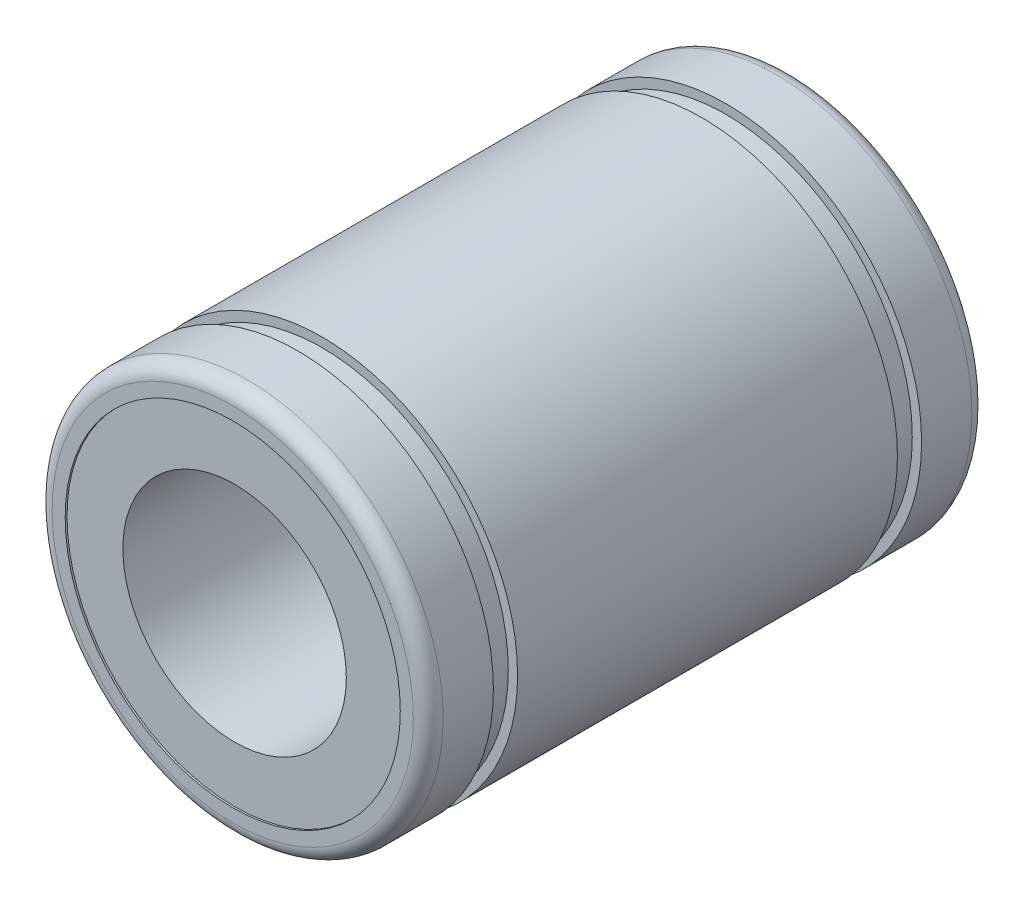
ISO-10303-21;
HEADER;
FILE_DESCRIPTION(('STEP AP214'),'2;1');
FILE_NAME('part.step','',(''),(''),'','','');
FILE_SCHEMA(('AUTOMOTIVE_DESIGN { 1 0 10303 214 1 1 1 1 }'));
ENDSEC;
DATA;
#1=APPLICATION_CONTEXT('core data for automotive mechanical design processes');
#2=APPLICATION_PROTOCOL_DEFINITION('international standard','automotive_design',2000,#1);
#3=PRODUCT_CONTEXT('',#1,'mechanical');
#4=PRODUCT('Part','Part','',(#3));
#5=PRODUCT_RELATED_PRODUCT_CATEGORY('part','',(#4));
#6=PRODUCT_DEFINITION_FORMATION('','',#4);
#7=PRODUCT_DEFINITION_CONTEXT('part definition',#1,'design');
#8=PRODUCT_DEFINITION('design','',#6,#7);
#9=PRODUCT_DEFINITION_SHAPE('','',#8);
#10=(LENGTH_UNIT() NAMED_UNIT(*) SI_UNIT(.MILLI.,.METRE.));
#11=(NAMED_UNIT(*) PLANE_ANGLE_UNIT() SI_UNIT($,.RADIAN.));
#12=(NAMED_UNIT(*) SI_UNIT($,.STERADIAN.) SOLID_ANGLE_UNIT());
#13=UNCERTAINTY_MEASURE_WITH_UNIT(LENGTH_MEASURE(1.E-05),#10,'distance_accuracy_value','');
#14=(GEOMETRIC_REPRESENTATION_CONTEXT(3) GLOBAL_UNCERTAINTY_ASSIGNED_CONTEXT((#13)) GLOBAL_UNIT_ASSIGNED_CONTEXT((#10,
#11,#12)) REPRESENTATION_CONTEXT('',''));
#15=CARTESIAN_POINT('',(0.,0.,0.));
#16=DIRECTION('',(0.,0.,1.));
#17=DIRECTION('',(1.,0.,0.));
#18=AXIS2_PLACEMENT_3D('',#15,#16,#17);
#19=CARTESIAN_POINT('',(0.,0.,2.9987460063796));
#20=DIRECTION('',(0.,0.,1.));
#21=DIRECTION('',(1.,0.,0.));
#22=AXIS2_PLACEMENT_3D('',#19,#20,#21);
#23=CYLINDRICAL_SURFACE('',#22,6.);
#24=CARTESIAN_POINT('',(0.,0.,32.9));
#25=DIRECTION('',(0.,0.,1.));
#26=DIRECTION('',(1.,0.,0.));
#27=AXIS2_PLACEMENT_3D('',#24,#25,#26);
#28=CIRCLE('',#27,6.);
#29=CARTESIAN_POINT('',(6.,0.,32.9));
#30=VERTEX_POINT('',#29);
#31=EDGE_CURVE('E48',#30,#30,#28,.T.);
#32=ORIENTED_EDGE('',*,*,#31,.T.);
#33=EDGE_LOOP('',(#32));
#34=FACE_BOUND('',#33,.T.);
#35=CARTESIAN_POINT('',(0.,0.,3.1));
#36=DIRECTION('',(0.,0.,-1.));
#37=DIRECTION('',(-1.,0.,0.));
#38=AXIS2_PLACEMENT_3D('',#35,#36,#37);
#39=CIRCLE('',#38,6.);
#40=CARTESIAN_POINT('',(-6.,0.,3.1));
#41=VERTEX_POINT('',#40);
#42=EDGE_CURVE('E36',#41,#41,#39,.T.);
#43=ORIENTED_EDGE('',*,*,#42,.T.);
#44=EDGE_LOOP('',(#43));
#45=FACE_BOUND('',#44,.T.);
#46=ADVANCED_FACE('F32',(#34,#45),#23,.F.);
#47=CARTESIAN_POINT('',(0.,0.,3.8));
#48=DIRECTION('',(0.,0.,1.));
#49=DIRECTION('',(1.,0.,0.));
#50=AXIS2_PLACEMENT_3D('',#47,#48,#49);
#51=TOROIDAL_SURFACE('',#50,9.7,0.8);
#52=CARTESIAN_POINT('',(0.,0.,3.));
#53=DIRECTION('',(0.,0.,1.));
#54=DIRECTION('',(1.,0.,0.));
#55=AXIS2_PLACEMENT_3D('',#52,#53,#54);
#56=CIRCLE('',#55,9.7);
#57=CARTESIAN_POINT('',(9.7,0.,3.));
#58=VERTEX_POINT('',#57);
#59=EDGE_CURVE('E10',#58,#58,#56,.T.);
#60=ORIENTED_EDGE('',*,*,#59,.T.);
#61=EDGE_LOOP('',(#60));
#62=FACE_BOUND('',#61,.T.);
#63=CARTESIAN_POINT('',(0.,0.,3.8));
#64=DIRECTION('',(0.,0.,1.));
#65=DIRECTION('',(1.,0.,0.));
#66=AXIS2_PLACEMENT_3D('',#63,#64,#65);
#67=CIRCLE('',#66,10.5);
#68=CARTESIAN_POINT('',(10.5,0.,3.8));
#69=VERTEX_POINT('',#68);
#70=EDGE_CURVE('E50',#69,#69,#67,.T.);
#71=ORIENTED_EDGE('',*,*,#70,.F.);
#72=EDGE_LOOP('',(#71));
#73=FACE_BOUND('',#72,.T.);
#74=ADVANCED_FACE('F34',(#62,#73),#51,.T.);
#75=CARTESIAN_POINT('',(9.7,0.,3.));
#76=DIRECTION('',(0.,0.,-1.));
#77=DIRECTION('',(-1.,0.,0.));
#78=AXIS2_PLACEMENT_3D('',#75,#76,#77);
#79=PLANE('',#78);
#80=CARTESIAN_POINT('',(0.,0.,3.));
#81=DIRECTION('',(0.,0.,-1.));
#82=DIRECTION('',(-1.,0.,0.));
#83=AXIS2_PLACEMENT_3D('',#80,#81,#82);
#84=CIRCLE('',#83,9.);
#85=CARTESIAN_POINT('',(-9.,0.,3.));
#86=VERTEX_POINT('',#85);
#87=EDGE_CURVE('E65',#86,#86,#84,.T.);
#88=ORIENTED_EDGE('',*,*,#87,.F.);
#89=EDGE_LOOP('',(#88));
#90=FACE_BOUND('',#89,.T.);
#91=ORIENTED_EDGE('',*,*,#59,.F.);
#92=EDGE_LOOP('',(#91));
#93=FACE_BOUND('',#92,.T.);
#94=ADVANCED_FACE('F115',(#90,#93),#79,.T.);
#95=CARTESIAN_POINT('',(6.,0.,33.));
#96=DIRECTION('',(0.,0.,1.));
#97=DIRECTION('',(1.,0.,0.));
#98=AXIS2_PLACEMENT_3D('',#95,#96,#97);
#99=PLANE('',#98);
#100=CARTESIAN_POINT('',(0.,0.,33.));
#101=DIRECTION('',(0.,0.,1.));
#102=DIRECTION('',(1.,0.,0.));
#103=AXIS2_PLACEMENT_3D('',#100,#101,#102);
#104=CIRCLE('',#103,9.);
#105=CARTESIAN_POINT('',(9.,0.,33.));
#106=VERTEX_POINT('',#105);
#107=EDGE_CURVE('E58',#106,#106,#104,.T.);
#108=ORIENTED_EDGE('',*,*,#107,.F.);
#109=EDGE_LOOP('',(#108));
#110=FACE_BOUND('',#109,.T.);
#111=CARTESIAN_POINT('',(0.,0.,33.));
#112=DIRECTION('',(0.,0.,1.));
#113=DIRECTION('',(1.,0.,0.));
#114=AXIS2_PLACEMENT_3D('',#111,#112,#113);
#115=CIRCLE('',#114,9.7);
#116=CARTESIAN_POINT('',(9.7,0.,33.));
#117=VERTEX_POINT('',#116);
#118=EDGE_CURVE('E40',#117,#117,#115,.T.);
#119=ORIENTED_EDGE('',*,*,#118,.T.);
#120=EDGE_LOOP('',(#119));
#121=FACE_BOUND('',#120,.T.);
#122=ADVANCED_FACE('F108',(#110,#121),#99,.T.);
#123=CARTESIAN_POINT('',(0.,0.,32.2));
#124=DIRECTION('',(0.,0.,1.));
#125=DIRECTION('',(1.,0.,0.));
#126=AXIS2_PLACEMENT_3D('',#123,#124,#125);
#127=TOROIDAL_SURFACE('',#126,9.7,0.799999999999999);
#128=CARTESIAN_POINT('',(0.,0.,32.2));
#129=DIRECTION('',(0.,0.,1.));
#130=DIRECTION('',(1.,0.,0.));
#131=AXIS2_PLACEMENT_3D('',#128,#129,#130);
#132=CIRCLE('',#131,10.5);
#133=CARTESIAN_POINT('',(10.5,0.,32.2));
#134=VERTEX_POINT('',#133);
#135=EDGE_CURVE('E45',#134,#134,#132,.T.);
#136=ORIENTED_EDGE('',*,*,#135,.T.);
#137=EDGE_LOOP('',(#136));
#138=FACE_BOUND('',#137,.T.);
#139=ORIENTED_EDGE('',*,*,#118,.F.);
#140=EDGE_LOOP('',(#139));
#141=FACE_BOUND('',#140,.T.);
#142=ADVANCED_FACE('F93',(#138,#141),#127,.T.);
#143=CARTESIAN_POINT('',(0.,0.,2.9987460063796));
#144=DIRECTION('',(0.,0.,1.));
#145=DIRECTION('',(1.,0.,0.));
#146=AXIS2_PLACEMENT_3D('',#143,#144,#145);
#147=CYLINDRICAL_SURFACE('',#146,10.5);
#148=CARTESIAN_POINT('',(0.,0.,29.5));
#149=DIRECTION('',(0.,0.,1.));
#150=DIRECTION('',(1.,0.,0.));
#151=AXIS2_PLACEMENT_3D('',#148,#149,#150);
#152=CIRCLE('',#151,10.5);
#153=CARTESIAN_POINT('',(10.5,0.,29.5));
#154=VERTEX_POINT('',#153);
#155=EDGE_CURVE('E88',#154,#154,#152,.T.);
#156=ORIENTED_EDGE('',*,*,#155,.T.);
#157=EDGE_LOOP('',(#156));
#158=FACE_BOUND('',#157,.T.);
#159=ORIENTED_EDGE('',*,*,#135,.F.);
#160=EDGE_LOOP('',(#159));
#161=FACE_BOUND('',#160,.T.);
#162=ADVANCED_FACE('F96',(#158,#161),#147,.T.);
#163=CARTESIAN_POINT('',(10.5,0.,29.5));
#164=DIRECTION('',(0.,0.,-1.));
#165=DIRECTION('',(-1.,0.,0.));
#166=AXIS2_PLACEMENT_3D('',#163,#164,#165);
#167=PLANE('',#166);
#168=CARTESIAN_POINT('',(0.,0.,29.5));
#169=DIRECTION('',(0.,0.,1.));
#170=DIRECTION('',(1.,0.,0.));
#171=AXIS2_PLACEMENT_3D('',#168,#169,#170);
#172=CIRCLE('',#171,10.);
#173=CARTESIAN_POINT('',(10.,0.,29.5));
#174=VERTEX_POINT('',#173);
#175=EDGE_CURVE('E85',#174,#174,#172,.T.);
#176=ORIENTED_EDGE('',*,*,#175,.T.);
#177=EDGE_LOOP('',(#176));
#178=FACE_BOUND('',#177,.T.);
#179=ORIENTED_EDGE('',*,*,#155,.F.);
#180=EDGE_LOOP('',(#179));
#181=FACE_BOUND('',#180,.T.);
#182=ADVANCED_FACE('F98',(#178,#181),#167,.T.);
#183=CARTESIAN_POINT('',(0.,0.,2.9987460063796));
#184=DIRECTION('',(0.,0.,1.));
#185=DIRECTION('',(1.,0.,0.));
#186=AXIS2_PLACEMENT_3D('',#183,#184,#185);
#187=CYLINDRICAL_SURFACE('',#186,10.);
#188=CARTESIAN_POINT('',(0.,0.,28.2));
#189=DIRECTION('',(0.,0.,1.));
#190=DIRECTION('',(1.,0.,0.));
#191=AXIS2_PLACEMENT_3D('',#188,#189,#190);
#192=CIRCLE('',#191,10.);
#193=CARTESIAN_POINT('',(10.,0.,28.2));
#194=VERTEX_POINT('',#193);
#195=EDGE_CURVE('E82',#194,#194,#192,.T.);
#196=ORIENTED_EDGE('',*,*,#195,.T.);
#197=EDGE_LOOP('',(#196));
#198=FACE_BOUND('',#197,.T.);
#199=ORIENTED_EDGE('',*,*,#175,.F.);
#200=EDGE_LOOP('',(#199));
#201=FACE_BOUND('',#200,.T.);
#202=ADVANCED_FACE('F105',(#198,#201),#187,.T.);
#203=CARTESIAN_POINT('',(10.,0.,28.2));
#204=DIRECTION('',(0.,0.,1.));
#205=DIRECTION('',(1.,0.,0.));
#206=AXIS2_PLACEMENT_3D('',#203,#204,#205);
#207=PLANE('',#206);
#208=CARTESIAN_POINT('',(0.,0.,28.2));
#209=DIRECTION('',(0.,0.,1.));
#210=DIRECTION('',(1.,0.,0.));
#211=AXIS2_PLACEMENT_3D('',#208,#209,#210);
#212=CIRCLE('',#211,10.5);
#213=CARTESIAN_POINT('',(10.5,0.,28.2));
#214=VERTEX_POINT('',#213);
#215=EDGE_CURVE('E79',#214,#214,#212,.T.);
#216=ORIENTED_EDGE('',*,*,#215,.T.);
#217=EDGE_LOOP('',(#216));
#218=FACE_BOUND('',#217,.T.);
#219=ORIENTED_EDGE('',*,*,#195,.F.);
#220=EDGE_LOOP('',(#219));
#221=FACE_BOUND('',#220,.T.);
#222=ADVANCED_FACE('F172',(#218,#221),#207,.T.);
#223=CARTESIAN_POINT('',(0.,0.,2.9987460063796));
#224=DIRECTION('',(0.,0.,1.));
#225=DIRECTION('',(1.,0.,0.));
#226=AXIS2_PLACEMENT_3D('',#223,#224,#225);
#227=CYLINDRICAL_SURFACE('',#226,10.5);
#228=CARTESIAN_POINT('',(0.,0.,7.8));
#229=DIRECTION('',(0.,0.,1.));
#230=DIRECTION('',(1.,0.,0.));
#231=AXIS2_PLACEMENT_3D('',#228,#229,#230);
#232=CIRCLE('',#231,10.5);
#233=CARTESIAN_POINT('',(10.5,0.,7.8));
#234=VERTEX_POINT('',#233);
#235=EDGE_CURVE('E76',#234,#234,#232,.T.);
#236=ORIENTED_EDGE('',*,*,#235,.T.);
#237=EDGE_LOOP('',(#236));
#238=FACE_BOUND('',#237,.T.);
#239=ORIENTED_EDGE('',*,*,#215,.F.);
#240=EDGE_LOOP('',(#239));
#241=FACE_BOUND('',#240,.T.);
#242=ADVANCED_FACE('F168',(#238,#241),#227,.T.);
#243=CARTESIAN_POINT('',(10.5,0.,7.8));
#244=DIRECTION('',(0.,0.,-1.));
#245=DIRECTION('',(-1.,0.,0.));
#246=AXIS2_PLACEMENT_3D('',#243,#244,#245);
#247=PLANE('',#246);
#248=CARTESIAN_POINT('',(0.,0.,7.8));
#249=DIRECTION('',(0.,0.,1.));
#250=DIRECTION('',(1.,0.,0.));
#251=AXIS2_PLACEMENT_3D('',#248,#249,#250);
#252=CIRCLE('',#251,10.);
#253=CARTESIAN_POINT('',(10.,0.,7.8));
#254=VERTEX_POINT('',#253);
#255=EDGE_CURVE('E73',#254,#254,#252,.T.);
#256=ORIENTED_EDGE('',*,*,#255,.T.);
#257=EDGE_LOOP('',(#256));
#258=FACE_BOUND('',#257,.T.);
#259=ORIENTED_EDGE('',*,*,#235,.F.);
#260=EDGE_LOOP('',(#259));
#261=FACE_BOUND('',#260,.T.);
#262=ADVANCED_FACE('F164',(#258,#261),#247,.T.);
#263=CARTESIAN_POINT('',(0.,0.,2.9987460063796));
#264=DIRECTION('',(0.,0.,1.));
#265=DIRECTION('',(1.,0.,0.));
#266=AXIS2_PLACEMENT_3D('',#263,#264,#265);
#267=CYLINDRICAL_SURFACE('',#266,10.);
#268=CARTESIAN_POINT('',(0.,0.,6.5));
#269=DIRECTION('',(0.,0.,1.));
#270=DIRECTION('',(1.,0.,0.));
#271=AXIS2_PLACEMENT_3D('',#268,#269,#270);
#272=CIRCLE('',#271,10.);
#273=CARTESIAN_POINT('',(10.,0.,6.5));
#274=VERTEX_POINT('',#273);
#275=EDGE_CURVE('E70',#274,#274,#272,.T.);
#276=ORIENTED_EDGE('',*,*,#275,.T.);
#277=EDGE_LOOP('',(#276));
#278=FACE_BOUND('',#277,.T.);
#279=ORIENTED_EDGE('',*,*,#255,.F.);
#280=EDGE_LOOP('',(#279));
#281=FACE_BOUND('',#280,.T.);
#282=ADVANCED_FACE('F160',(#278,#281),#267,.T.);
#283=CARTESIAN_POINT('',(10.,0.,6.5));
#284=DIRECTION('',(0.,0.,1.));
#285=DIRECTION('',(1.,0.,0.));
#286=AXIS2_PLACEMENT_3D('',#283,#284,#285);
#287=PLANE('',#286);
#288=CARTESIAN_POINT('',(0.,0.,6.49999999999999));
#289=DIRECTION('',(0.,0.,1.));
#290=DIRECTION('',(1.,0.,0.));
#291=AXIS2_PLACEMENT_3D('',#288,#289,#290);
#292=CIRCLE('',#291,10.5);
#293=CARTESIAN_POINT('',(10.5,0.,6.49999999999999));
#294=VERTEX_POINT('',#293);
#295=EDGE_CURVE('E55',#294,#294,#292,.T.);
#296=ORIENTED_EDGE('',*,*,#295,.T.);
#297=EDGE_LOOP('',(#296));
#298=FACE_BOUND('',#297,.T.);
#299=ORIENTED_EDGE('',*,*,#275,.F.);
#300=EDGE_LOOP('',(#299));
#301=FACE_BOUND('',#300,.T.);
#302=ADVANCED_FACE('F156',(#298,#301),#287,.T.);
#303=CARTESIAN_POINT('',(0.,0.,2.9987460063796));
#304=DIRECTION('',(0.,0.,1.));
#305=DIRECTION('',(1.,0.,0.));
#306=AXIS2_PLACEMENT_3D('',#303,#304,#305);
#307=CYLINDRICAL_SURFACE('',#306,10.5);
#308=ORIENTED_EDGE('',*,*,#70,.T.);
#309=EDGE_LOOP('',(#308));
#310=FACE_BOUND('',#309,.T.);
#311=ORIENTED_EDGE('',*,*,#295,.F.);
#312=EDGE_LOOP('',(#311));
#313=FACE_BOUND('',#312,.T.);
#314=ADVANCED_FACE('F152',(#310,#313),#307,.T.);
#315=CARTESIAN_POINT('',(0.,0.,32.9));
#316=DIRECTION('',(0.,0.,1.));
#317=DIRECTION('',(1.,0.,0.));
#318=AXIS2_PLACEMENT_3D('',#315,#316,#317);
#319=CYLINDRICAL_SURFACE('',#318,9.);
#320=CARTESIAN_POINT('',(0.,0.,32.9));
#321=DIRECTION('',(0.,0.,1.));
#322=DIRECTION('',(1.,0.,0.));
#323=AXIS2_PLACEMENT_3D('',#320,#321,#322);
#324=CIRCLE('',#323,9.);
#325=CARTESIAN_POINT('',(9.,0.,32.9));
#326=VERTEX_POINT('',#325);
#327=EDGE_CURVE('E51',#326,#326,#324,.T.);
#328=ORIENTED_EDGE('',*,*,#327,.F.);
#329=EDGE_LOOP('',(#328));
#330=FACE_BOUND('',#329,.T.);
#331=ORIENTED_EDGE('',*,*,#107,.T.);
#332=EDGE_LOOP('',(#331));
#333=FACE_BOUND('',#332,.T.);
#334=ADVANCED_FACE('F148',(#330,#333),#319,.F.);
#335=CARTESIAN_POINT('',(0.,0.,32.9));
#336=DIRECTION('',(0.,0.,1.));
#337=DIRECTION('',(1.,0.,0.));
#338=AXIS2_PLACEMENT_3D('',#335,#336,#337);
#339=PLANE('',#338);
#340=ORIENTED_EDGE('',*,*,#31,.F.);
#341=EDGE_LOOP('',(#340));
#342=FACE_BOUND('',#341,.T.);
#343=ORIENTED_EDGE('',*,*,#327,.T.);
#344=EDGE_LOOP('',(#343));
#345=FACE_BOUND('',#344,.T.);
#346=ADVANCED_FACE('F142',(#342,#345),#339,.T.);
#347=CARTESIAN_POINT('',(0.,0.,3.1));
#348=DIRECTION('',(0.,0.,-1.));
#349=DIRECTION('',(-1.,0.,0.));
#350=AXIS2_PLACEMENT_3D('',#347,#348,#349);
#351=CYLINDRICAL_SURFACE('',#350,9.);
#352=CARTESIAN_POINT('',(0.,0.,3.1));
#353=DIRECTION('',(0.,0.,-1.));
#354=DIRECTION('',(-1.,0.,0.));
#355=AXIS2_PLACEMENT_3D('',#352,#353,#354);
#356=CIRCLE('',#355,9.);
#357=CARTESIAN_POINT('',(-9.,0.,3.1));
#358=VERTEX_POINT('',#357);
#359=EDGE_CURVE('E128',#358,#358,#356,.T.);
#360=ORIENTED_EDGE('',*,*,#359,.F.);
#361=EDGE_LOOP('',(#360));
#362=FACE_BOUND('',#361,.T.);
#363=ORIENTED_EDGE('',*,*,#87,.T.);
#364=EDGE_LOOP('',(#363));
#365=FACE_BOUND('',#364,.T.);
#366=ADVANCED_FACE('F137',(#362,#365),#351,.F.);
#367=CARTESIAN_POINT('',(0.,0.,3.1));
#368=DIRECTION('',(0.,0.,-1.));
#369=DIRECTION('',(-1.,0.,0.));
#370=AXIS2_PLACEMENT_3D('',#367,#368,#369);
#371=PLANE('',#370);
#372=ORIENTED_EDGE('',*,*,#42,.F.);
#373=EDGE_LOOP('',(#372));
#374=FACE_BOUND('',#373,.T.);
#375=ORIENTED_EDGE('',*,*,#359,.T.);
#376=EDGE_LOOP('',(#375));
#377=FACE_BOUND('',#376,.T.);
#378=ADVANCED_FACE('F135',(#374,#377),#371,.T.);
#379=CLOSED_SHELL('',(#46,#74,#94,#122,#142,#162,#182,#202,#222,#242,#262,#282,#302,#314,#334,
#346,#366,#378));
#380=MANIFOLD_SOLID_BREP('B2',#379);
#381=ADVANCED_BREP_SHAPE_REPRESENTATION('',(#18,#380),#14);
#382=SHAPE_DEFINITION_REPRESENTATION(#9,#381);
ENDSEC;
END-ISO-10303-21;
